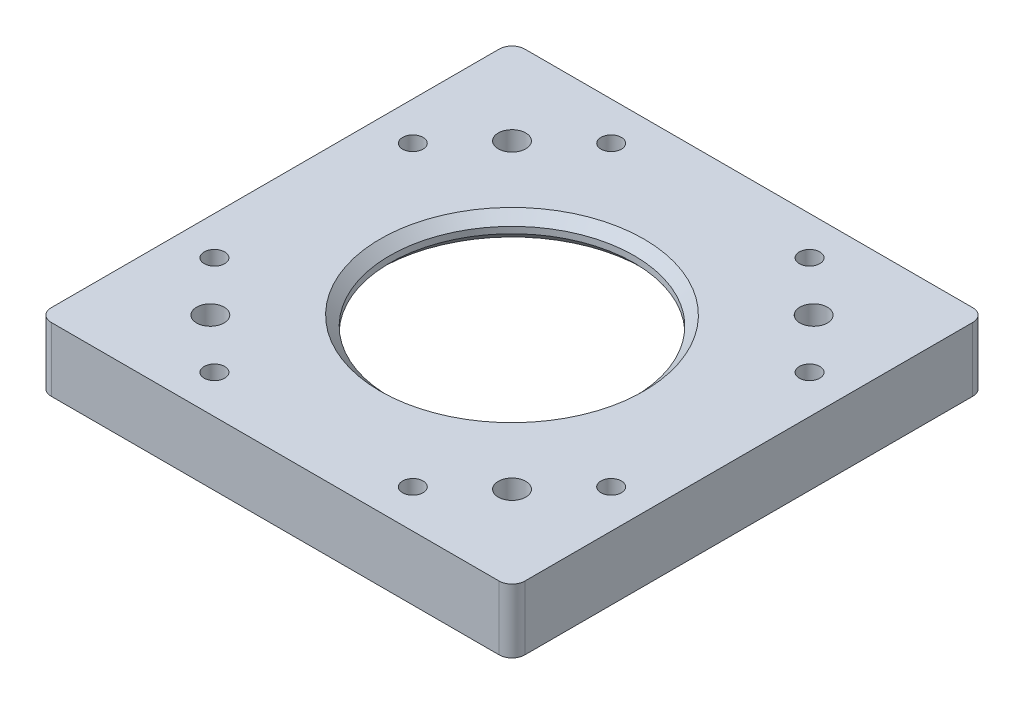
ISO-10303-21;
HEADER;
FILE_DESCRIPTION(('STEP AP214'),'2;1');
FILE_NAME('part.step','',(''),(''),'','','');
FILE_SCHEMA(('AUTOMOTIVE_DESIGN { 1 0 10303 214 1 1 1 1 }'));
ENDSEC;
DATA;
#1=APPLICATION_CONTEXT('core data for automotive mechanical design processes');
#2=APPLICATION_PROTOCOL_DEFINITION('international standard','automotive_design',2000,#1);
#3=PRODUCT_CONTEXT('',#1,'mechanical');
#4=PRODUCT('Part','Part','',(#3));
#5=PRODUCT_RELATED_PRODUCT_CATEGORY('part','',(#4));
#6=PRODUCT_DEFINITION_FORMATION('','',#4);
#7=PRODUCT_DEFINITION_CONTEXT('part definition',#1,'design');
#8=PRODUCT_DEFINITION('design','',#6,#7);
#9=PRODUCT_DEFINITION_SHAPE('','',#8);
#10=(LENGTH_UNIT() NAMED_UNIT(*) SI_UNIT(.MILLI.,.METRE.));
#11=(NAMED_UNIT(*) PLANE_ANGLE_UNIT() SI_UNIT($,.RADIAN.));
#12=(NAMED_UNIT(*) SI_UNIT($,.STERADIAN.) SOLID_ANGLE_UNIT());
#13=UNCERTAINTY_MEASURE_WITH_UNIT(LENGTH_MEASURE(1.E-05),#10,'distance_accuracy_value','');
#14=(GEOMETRIC_REPRESENTATION_CONTEXT(3) GLOBAL_UNCERTAINTY_ASSIGNED_CONTEXT((#13)) GLOBAL_UNIT_ASSIGNED_CONTEXT((#10,
#11,#12)) REPRESENTATION_CONTEXT('',''));
#15=CARTESIAN_POINT('',(0.,0.,0.));
#16=DIRECTION('',(0.,0.,1.));
#17=DIRECTION('',(1.,0.,0.));
#18=AXIS2_PLACEMENT_3D('',#15,#16,#17);
#19=CARTESIAN_POINT('',(0.,10.,0.));
#20=DIRECTION('',(0.,-1.,0.));
#21=DIRECTION('',(0.,0.,-1.));
#22=AXIS2_PLACEMENT_3D('',#19,#20,#21);
#23=PLANE('',#22);
#24=CARTESIAN_POINT('',(0.,10.,0.));
#25=DIRECTION('',(0.,-1.,0.));
#26=DIRECTION('',(0.,0.,-1.));
#27=AXIS2_PLACEMENT_3D('',#24,#25,#26);
#28=CIRCLE('',#27,20.5999999999999);
#29=CARTESIAN_POINT('',(0.,10.,-20.5999999999999));
#30=VERTEX_POINT('',#29);
#31=EDGE_CURVE('E376',#30,#30,#28,.T.);
#32=ORIENTED_EDGE('',*,*,#31,.T.);
#33=EDGE_LOOP('',(#32));
#34=FACE_BOUND('',#33,.T.);
#35=DIRECTION('',(-1.,0.,0.));
#36=VECTOR('',#35,1.);
#37=CARTESIAN_POINT('',(-37.,10.,-37.));
#38=LINE('',#37,#36);
#39=CARTESIAN_POINT('',(35.,10.,-37.));
#40=VERTEX_POINT('',#39);
#41=CARTESIAN_POINT('',(-35.,10.,-37.));
#42=VERTEX_POINT('',#41);
#43=EDGE_CURVE('E301',#40,#42,#38,.T.);
#44=ORIENTED_EDGE('',*,*,#43,.T.);
#45=CARTESIAN_POINT('',(-35.,10.,-35.));
#46=DIRECTION('',(0.,-1.,0.));
#47=DIRECTION('',(0.,0.,-1.));
#48=AXIS2_PLACEMENT_3D('',#45,#46,#47);
#49=CIRCLE('',#48,2.);
#50=CARTESIAN_POINT('',(-37.,10.,-35.));
#51=VERTEX_POINT('',#50);
#52=EDGE_CURVE('E418',#42,#51,#49,.F.);
#53=ORIENTED_EDGE('',*,*,#52,.T.);
#54=DIRECTION('',(0.,0.,1.));
#55=VECTOR('',#54,1.);
#56=CARTESIAN_POINT('',(-37.,10.,37.));
#57=LINE('',#56,#55);
#58=CARTESIAN_POINT('',(-37.,10.,35.));
#59=VERTEX_POINT('',#58);
#60=EDGE_CURVE('E306',#51,#59,#57,.T.);
#61=ORIENTED_EDGE('',*,*,#60,.T.);
#62=CARTESIAN_POINT('',(-35.,10.,35.));
#63=DIRECTION('',(0.,-1.,0.));
#64=DIRECTION('',(0.,0.,-1.));
#65=AXIS2_PLACEMENT_3D('',#62,#63,#64);
#66=CIRCLE('',#65,2.);
#67=CARTESIAN_POINT('',(-35.,10.,37.));
#68=VERTEX_POINT('',#67);
#69=EDGE_CURVE('E64',#59,#68,#66,.F.);
#70=ORIENTED_EDGE('',*,*,#69,.T.);
#71=DIRECTION('',(1.,0.,0.));
#72=VECTOR('',#71,1.);
#73=CARTESIAN_POINT('',(-37.,10.,37.));
#74=LINE('',#73,#72);
#75=CARTESIAN_POINT('',(35.,10.,37.));
#76=VERTEX_POINT('',#75);
#77=EDGE_CURVE('E309',#68,#76,#74,.T.);
#78=ORIENTED_EDGE('',*,*,#77,.T.);
#79=CARTESIAN_POINT('',(35.,10.,35.));
#80=DIRECTION('',(0.,-1.,0.));
#81=DIRECTION('',(0.,0.,-1.));
#82=AXIS2_PLACEMENT_3D('',#79,#80,#81);
#83=CIRCLE('',#82,2.);
#84=CARTESIAN_POINT('',(37.,10.,35.));
#85=VERTEX_POINT('',#84);
#86=EDGE_CURVE('E412',#76,#85,#83,.F.);
#87=ORIENTED_EDGE('',*,*,#86,.T.);
#88=DIRECTION('',(0.,0.,-1.));
#89=VECTOR('',#88,1.);
#90=CARTESIAN_POINT('',(37.,10.,37.));
#91=LINE('',#90,#89);
#92=CARTESIAN_POINT('',(37.,10.,-35.));
#93=VERTEX_POINT('',#92);
#94=EDGE_CURVE('E297',#85,#93,#91,.T.);
#95=ORIENTED_EDGE('',*,*,#94,.T.);
#96=CARTESIAN_POINT('',(35.,10.,-35.));
#97=DIRECTION('',(0.,-1.,0.));
#98=DIRECTION('',(0.,0.,-1.));
#99=AXIS2_PLACEMENT_3D('',#96,#97,#98);
#100=CIRCLE('',#99,2.);
#101=EDGE_CURVE('E415',#93,#40,#100,.F.);
#102=ORIENTED_EDGE('',*,*,#101,.T.);
#103=EDGE_LOOP('',(#44,#53,#61,#70,#78,#87,#95,#102));
#104=FACE_BOUND('',#103,.T.);
#105=CARTESIAN_POINT('',(23.57,10.,-23.57));
#106=DIRECTION('',(0.,1.,0.));
#107=DIRECTION('',(0.,0.,1.));
#108=AXIS2_PLACEMENT_3D('',#105,#106,#107);
#109=CIRCLE('',#108,2.15000000000001);
#110=CARTESIAN_POINT('',(23.57,10.,-21.42));
#111=VERTEX_POINT('',#110);
#112=EDGE_CURVE('E292',#111,#111,#109,.T.);
#113=ORIENTED_EDGE('',*,*,#112,.F.);
#114=EDGE_LOOP('',(#113));
#115=FACE_BOUND('',#114,.T.);
#116=CARTESIAN_POINT('',(-23.57,10.,-23.5699999999997));
#117=DIRECTION('',(0.,1.,0.));
#118=DIRECTION('',(0.,0.,1.));
#119=AXIS2_PLACEMENT_3D('',#116,#117,#118);
#120=CIRCLE('',#119,2.15000000000001);
#121=CARTESIAN_POINT('',(-23.57,10.,-21.4199999999997));
#122=VERTEX_POINT('',#121);
#123=EDGE_CURVE('E288',#122,#122,#120,.T.);
#124=ORIENTED_EDGE('',*,*,#123,.F.);
#125=EDGE_LOOP('',(#124));
#126=FACE_BOUND('',#125,.T.);
#127=CARTESIAN_POINT('',(-23.5699999999995,10.,23.5700000000003));
#128=DIRECTION('',(0.,1.,0.));
#129=DIRECTION('',(0.,0.,1.));
#130=AXIS2_PLACEMENT_3D('',#127,#128,#129);
#131=CIRCLE('',#130,2.15000000000001);
#132=CARTESIAN_POINT('',(-23.5699999999995,10.,25.7200000000003));
#133=VERTEX_POINT('',#132);
#134=EDGE_CURVE('E284',#133,#133,#131,.T.);
#135=ORIENTED_EDGE('',*,*,#134,.F.);
#136=EDGE_LOOP('',(#135));
#137=FACE_BOUND('',#136,.T.);
#138=CARTESIAN_POINT('',(23.5700000000005,10.,23.57));
#139=DIRECTION('',(0.,1.,0.));
#140=DIRECTION('',(0.,0.,1.));
#141=AXIS2_PLACEMENT_3D('',#138,#139,#140);
#142=CIRCLE('',#141,2.14999999999999);
#143=CARTESIAN_POINT('',(23.5700000000005,10.,25.72));
#144=VERTEX_POINT('',#143);
#145=EDGE_CURVE('E277',#144,#144,#142,.T.);
#146=ORIENTED_EDGE('',*,*,#145,.F.);
#147=EDGE_LOOP('',(#146));
#148=FACE_BOUND('',#147,.T.);
#149=CARTESIAN_POINT('',(15.5,10.,-31.));
#150=DIRECTION('',(0.,1.,0.));
#151=DIRECTION('',(0.,0.,1.));
#152=AXIS2_PLACEMENT_3D('',#149,#150,#151);
#153=CIRCLE('',#152,1.6);
#154=CARTESIAN_POINT('',(15.5,10.,-29.4));
#155=VERTEX_POINT('',#154);
#156=EDGE_CURVE('E273',#155,#155,#153,.T.);
#157=ORIENTED_EDGE('',*,*,#156,.F.);
#158=EDGE_LOOP('',(#157));
#159=FACE_BOUND('',#158,.T.);
#160=CARTESIAN_POINT('',(-15.5,10.,-31.));
#161=DIRECTION('',(0.,1.,0.));
#162=DIRECTION('',(0.,0.,-1.));
#163=AXIS2_PLACEMENT_3D('',#160,#161,#162);
#164=CIRCLE('',#163,1.6);
#165=CARTESIAN_POINT('',(-15.5,10.,-32.6));
#166=VERTEX_POINT('',#165);
#167=EDGE_CURVE('E265',#166,#166,#164,.T.);
#168=ORIENTED_EDGE('',*,*,#167,.F.);
#169=EDGE_LOOP('',(#168));
#170=FACE_BOUND('',#169,.T.);
#171=CARTESIAN_POINT('',(31.0000000000009,10.,15.4999999999991));
#172=DIRECTION('',(0.,1.,0.));
#173=DIRECTION('',(0.,0.,1.));
#174=AXIS2_PLACEMENT_3D('',#171,#172,#173);
#175=CIRCLE('',#174,1.60000000000067);
#176=CARTESIAN_POINT('',(31.0000000000009,10.,17.0999999999998));
#177=VERTEX_POINT('',#176);
#178=EDGE_CURVE('E257',#177,#177,#175,.T.);
#179=ORIENTED_EDGE('',*,*,#178,.F.);
#180=EDGE_LOOP('',(#179));
#181=FACE_BOUND('',#180,.T.);
#182=CARTESIAN_POINT('',(31.0000000000009,10.,-15.5000000000009));
#183=DIRECTION('',(0.,1.,0.));
#184=DIRECTION('',(0.,0.,-1.));
#185=AXIS2_PLACEMENT_3D('',#182,#183,#184);
#186=CIRCLE('',#185,1.59999999999882);
#187=CARTESIAN_POINT('',(31.0000000000009,10.,-17.0999999999997));
#188=VERTEX_POINT('',#187);
#189=EDGE_CURVE('E249',#188,#188,#186,.T.);
#190=ORIENTED_EDGE('',*,*,#189,.F.);
#191=EDGE_LOOP('',(#190));
#192=FACE_BOUND('',#191,.T.);
#193=CARTESIAN_POINT('',(-15.4999999999983,10.,31.));
#194=DIRECTION('',(0.,1.,0.));
#195=DIRECTION('',(0.,0.,1.));
#196=AXIS2_PLACEMENT_3D('',#193,#194,#195);
#197=CIRCLE('',#196,1.60000000000185);
#198=CARTESIAN_POINT('',(-15.4999999999983,10.,32.6000000000019));
#199=VERTEX_POINT('',#198);
#200=EDGE_CURVE('E241',#199,#199,#197,.T.);
#201=ORIENTED_EDGE('',*,*,#200,.F.);
#202=EDGE_LOOP('',(#201));
#203=FACE_BOUND('',#202,.T.);
#204=CARTESIAN_POINT('',(15.5000000000017,10.,31.));
#205=DIRECTION('',(0.,1.,0.));
#206=DIRECTION('',(0.,0.,-1.));
#207=AXIS2_PLACEMENT_3D('',#204,#205,#206);
#208=CIRCLE('',#207,1.59999999999816);
#209=CARTESIAN_POINT('',(15.5000000000017,10.,29.4000000000018));
#210=VERTEX_POINT('',#209);
#211=EDGE_CURVE('E233',#210,#210,#208,.T.);
#212=ORIENTED_EDGE('',*,*,#211,.F.);
#213=EDGE_LOOP('',(#212));
#214=FACE_BOUND('',#213,.T.);
#215=CARTESIAN_POINT('',(-30.9999999999991,10.,-15.4999999999991));
#216=DIRECTION('',(0.,1.,0.));
#217=DIRECTION('',(0.,0.,1.));
#218=AXIS2_PLACEMENT_3D('',#215,#216,#217);
#219=CIRCLE('',#218,1.60000000000136);
#220=CARTESIAN_POINT('',(-30.9999999999991,10.,-13.8999999999978));
#221=VERTEX_POINT('',#220);
#222=EDGE_CURVE('E225',#221,#221,#219,.T.);
#223=ORIENTED_EDGE('',*,*,#222,.F.);
#224=EDGE_LOOP('',(#223));
#225=FACE_BOUND('',#224,.T.);
#226=CARTESIAN_POINT('',(-30.9999999999991,10.,15.5000000000009));
#227=DIRECTION('',(0.,1.,0.));
#228=DIRECTION('',(0.,0.,-1.));
#229=AXIS2_PLACEMENT_3D('',#226,#227,#228);
#230=CIRCLE('',#229,1.59999999999916);
#231=CARTESIAN_POINT('',(-30.9999999999991,10.,13.9000000000017));
#232=VERTEX_POINT('',#231);
#233=EDGE_CURVE('E217',#232,#232,#230,.T.);
#234=ORIENTED_EDGE('',*,*,#233,.F.);
#235=EDGE_LOOP('',(#234));
#236=FACE_BOUND('',#235,.T.);
#237=ADVANCED_FACE('F43',(#34,#104,#115,#126,#137,#148,#159,#170,#181,#192,#203,#214,#225,#236),
#23,.F.);
#238=CARTESIAN_POINT('',(0.,0.,0.));
#239=DIRECTION('',(0.,-1.,0.));
#240=DIRECTION('',(0.,0.,-1.));
#241=AXIS2_PLACEMENT_3D('',#238,#239,#240);
#242=PLANE('',#241);
#243=DIRECTION('',(0.,0.,1.));
#244=VECTOR('',#243,1.);
#245=CARTESIAN_POINT('',(28.6,0.,-28.6));
#246=LINE('',#245,#244);
#247=CARTESIAN_POINT('',(28.6,0.,-25.6));
#248=VERTEX_POINT('',#247);
#249=CARTESIAN_POINT('',(28.6,0.,25.6));
#250=VERTEX_POINT('',#249);
#251=EDGE_CURVE('E189',#248,#250,#246,.T.);
#252=ORIENTED_EDGE('',*,*,#251,.F.);
#253=CARTESIAN_POINT('',(25.6,0.,-25.6));
#254=DIRECTION('',(0.,-1.,0.));
#255=DIRECTION('',(0.,0.,-1.));
#256=AXIS2_PLACEMENT_3D('',#253,#254,#255);
#257=CIRCLE('',#256,3.);
#258=CARTESIAN_POINT('',(25.6,0.,-28.6));
#259=VERTEX_POINT('',#258);
#260=EDGE_CURVE('E168',#248,#259,#257,.F.);
#261=ORIENTED_EDGE('',*,*,#260,.T.);
#262=DIRECTION('',(1.,0.,0.));
#263=VECTOR('',#262,1.);
#264=CARTESIAN_POINT('',(-28.6,0.,-28.6));
#265=LINE('',#264,#263);
#266=CARTESIAN_POINT('',(-25.6,0.,-28.6));
#267=VERTEX_POINT('',#266);
#268=EDGE_CURVE('E194',#267,#259,#265,.T.);
#269=ORIENTED_EDGE('',*,*,#268,.F.);
#270=CARTESIAN_POINT('',(-25.6,0.,-25.6));
#271=DIRECTION('',(0.,-1.,0.));
#272=DIRECTION('',(0.,0.,-1.));
#273=AXIS2_PLACEMENT_3D('',#270,#271,#272);
#274=CIRCLE('',#273,3.);
#275=CARTESIAN_POINT('',(-28.6,0.,-25.6));
#276=VERTEX_POINT('',#275);
#277=EDGE_CURVE('E363',#267,#276,#274,.F.);
#278=ORIENTED_EDGE('',*,*,#277,.T.);
#279=DIRECTION('',(0.,0.,-1.));
#280=VECTOR('',#279,1.);
#281=CARTESIAN_POINT('',(-28.6,0.,-28.6));
#282=LINE('',#281,#280);
#283=CARTESIAN_POINT('',(-28.6,0.,25.6));
#284=VERTEX_POINT('',#283);
#285=EDGE_CURVE('E188',#284,#276,#282,.T.);
#286=ORIENTED_EDGE('',*,*,#285,.F.);
#287=CARTESIAN_POINT('',(-25.6,0.,25.6));
#288=DIRECTION('',(0.,-1.,0.));
#289=DIRECTION('',(0.,0.,-1.));
#290=AXIS2_PLACEMENT_3D('',#287,#288,#289);
#291=CIRCLE('',#290,3.);
#292=CARTESIAN_POINT('',(-25.6,0.,28.6));
#293=VERTEX_POINT('',#292);
#294=EDGE_CURVE('E186',#284,#293,#291,.F.);
#295=ORIENTED_EDGE('',*,*,#294,.T.);
#296=DIRECTION('',(-1.,0.,0.));
#297=VECTOR('',#296,1.);
#298=CARTESIAN_POINT('',(-28.6,0.,28.6));
#299=LINE('',#298,#297);
#300=CARTESIAN_POINT('',(25.6,0.,28.6));
#301=VERTEX_POINT('',#300);
#302=EDGE_CURVE('E175',#301,#293,#299,.T.);
#303=ORIENTED_EDGE('',*,*,#302,.F.);
#304=CARTESIAN_POINT('',(25.6,0.,25.6));
#305=DIRECTION('',(0.,-1.,0.));
#306=DIRECTION('',(0.,0.,-1.));
#307=AXIS2_PLACEMENT_3D('',#304,#305,#306);
#308=CIRCLE('',#307,3.);
#309=EDGE_CURVE('E157',#301,#250,#308,.F.);
#310=ORIENTED_EDGE('',*,*,#309,.T.);
#311=EDGE_LOOP('',(#252,#261,#269,#278,#286,#295,#303,#310));
#312=FACE_BOUND('',#311,.T.);
#313=CARTESIAN_POINT('',(-30.9999999999991,0.,-15.4999999999991));
#314=DIRECTION('',(0.,1.,0.));
#315=DIRECTION('',(0.,0.,1.));
#316=AXIS2_PLACEMENT_3D('',#313,#314,#315);
#317=CIRCLE('',#316,1.60000000000136);
#318=CARTESIAN_POINT('',(-30.9999999999991,0.,-13.8999999999978));
#319=VERTEX_POINT('',#318);
#320=EDGE_CURVE('E221',#319,#319,#317,.T.);
#321=ORIENTED_EDGE('',*,*,#320,.T.);
#322=EDGE_LOOP('',(#321));
#323=FACE_BOUND('',#322,.T.);
#324=CARTESIAN_POINT('',(-15.4999999999983,0.,31.));
#325=DIRECTION('',(0.,1.,0.));
#326=DIRECTION('',(0.,0.,1.));
#327=AXIS2_PLACEMENT_3D('',#324,#325,#326);
#328=CIRCLE('',#327,1.60000000000185);
#329=CARTESIAN_POINT('',(-15.4999999999983,0.,32.6000000000019));
#330=VERTEX_POINT('',#329);
#331=EDGE_CURVE('E237',#330,#330,#328,.T.);
#332=ORIENTED_EDGE('',*,*,#331,.T.);
#333=EDGE_LOOP('',(#332));
#334=FACE_BOUND('',#333,.T.);
#335=CARTESIAN_POINT('',(31.0000000000009,0.,15.4999999999991));
#336=DIRECTION('',(0.,1.,0.));
#337=DIRECTION('',(0.,0.,1.));
#338=AXIS2_PLACEMENT_3D('',#335,#336,#337);
#339=CIRCLE('',#338,1.60000000000067);
#340=CARTESIAN_POINT('',(31.0000000000009,0.,17.0999999999998));
#341=VERTEX_POINT('',#340);
#342=EDGE_CURVE('E253',#341,#341,#339,.T.);
#343=ORIENTED_EDGE('',*,*,#342,.T.);
#344=EDGE_LOOP('',(#343));
#345=FACE_BOUND('',#344,.T.);
#346=CARTESIAN_POINT('',(15.5,0.,-31.));
#347=DIRECTION('',(0.,1.,0.));
#348=DIRECTION('',(0.,0.,1.));
#349=AXIS2_PLACEMENT_3D('',#346,#347,#348);
#350=CIRCLE('',#349,1.6);
#351=CARTESIAN_POINT('',(15.5,0.,-29.4));
#352=VERTEX_POINT('',#351);
#353=EDGE_CURVE('E269',#352,#352,#350,.T.);
#354=ORIENTED_EDGE('',*,*,#353,.T.);
#355=EDGE_LOOP('',(#354));
#356=FACE_BOUND('',#355,.T.);
#357=DIRECTION('',(0.,0.,1.));
#358=VECTOR('',#357,1.);
#359=CARTESIAN_POINT('',(-37.,0.,37.));
#360=LINE('',#359,#358);
#361=CARTESIAN_POINT('',(-37.,0.,-35.));
#362=VERTEX_POINT('',#361);
#363=CARTESIAN_POINT('',(-37.,0.,35.));
#364=VERTEX_POINT('',#363);
#365=EDGE_CURVE('E319',#362,#364,#360,.T.);
#366=ORIENTED_EDGE('',*,*,#365,.F.);
#367=CARTESIAN_POINT('',(-35.,0.,-35.));
#368=DIRECTION('',(0.,-1.,0.));
#369=DIRECTION('',(0.,0.,-1.));
#370=AXIS2_PLACEMENT_3D('',#367,#368,#369);
#371=CIRCLE('',#370,2.);
#372=CARTESIAN_POINT('',(-35.,0.,-37.));
#373=VERTEX_POINT('',#372);
#374=EDGE_CURVE('E400',#362,#373,#371,.T.);
#375=ORIENTED_EDGE('',*,*,#374,.T.);
#376=DIRECTION('',(-1.,0.,0.));
#377=VECTOR('',#376,1.);
#378=CARTESIAN_POINT('',(-37.,0.,-37.));
#379=LINE('',#378,#377);
#380=CARTESIAN_POINT('',(35.,0.,-37.));
#381=VERTEX_POINT('',#380);
#382=EDGE_CURVE('E315',#381,#373,#379,.T.);
#383=ORIENTED_EDGE('',*,*,#382,.F.);
#384=CARTESIAN_POINT('',(35.,0.,-35.));
#385=DIRECTION('',(0.,-1.,0.));
#386=DIRECTION('',(0.,0.,-1.));
#387=AXIS2_PLACEMENT_3D('',#384,#385,#386);
#388=CIRCLE('',#387,2.);
#389=CARTESIAN_POINT('',(37.,0.,-35.));
#390=VERTEX_POINT('',#389);
#391=EDGE_CURVE('E397',#381,#390,#388,.T.);
#392=ORIENTED_EDGE('',*,*,#391,.T.);
#393=DIRECTION('',(0.,0.,-1.));
#394=VECTOR('',#393,1.);
#395=CARTESIAN_POINT('',(37.,0.,37.));
#396=LINE('',#395,#394);
#397=CARTESIAN_POINT('',(37.,0.,35.));
#398=VERTEX_POINT('',#397);
#399=EDGE_CURVE('E296',#398,#390,#396,.T.);
#400=ORIENTED_EDGE('',*,*,#399,.F.);
#401=CARTESIAN_POINT('',(35.,0.,35.));
#402=DIRECTION('',(0.,-1.,0.));
#403=DIRECTION('',(0.,0.,-1.));
#404=AXIS2_PLACEMENT_3D('',#401,#402,#403);
#405=CIRCLE('',#404,2.);
#406=CARTESIAN_POINT('',(35.,0.,37.));
#407=VERTEX_POINT('',#406);
#408=EDGE_CURVE('E394',#398,#407,#405,.T.);
#409=ORIENTED_EDGE('',*,*,#408,.T.);
#410=DIRECTION('',(1.,0.,0.));
#411=VECTOR('',#410,1.);
#412=CARTESIAN_POINT('',(-37.,0.,37.));
#413=LINE('',#412,#411);
#414=CARTESIAN_POINT('',(-35.,0.,37.));
#415=VERTEX_POINT('',#414);
#416=EDGE_CURVE('E302',#415,#407,#413,.T.);
#417=ORIENTED_EDGE('',*,*,#416,.F.);
#418=CARTESIAN_POINT('',(-35.,0.,35.));
#419=DIRECTION('',(0.,-1.,0.));
#420=DIRECTION('',(0.,0.,-1.));
#421=AXIS2_PLACEMENT_3D('',#418,#419,#420);
#422=CIRCLE('',#421,2.);
#423=EDGE_CURVE('E391',#415,#364,#422,.T.);
#424=ORIENTED_EDGE('',*,*,#423,.T.);
#425=EDGE_LOOP('',(#366,#375,#383,#392,#400,#409,#417,#424));
#426=FACE_BOUND('',#425,.T.);
#427=CARTESIAN_POINT('',(-15.5,0.,-31.));
#428=DIRECTION('',(0.,1.,0.));
#429=DIRECTION('',(0.,0.,-1.));
#430=AXIS2_PLACEMENT_3D('',#427,#428,#429);
#431=CIRCLE('',#430,1.6);
#432=CARTESIAN_POINT('',(-15.5,0.,-32.6));
#433=VERTEX_POINT('',#432);
#434=EDGE_CURVE('E261',#433,#433,#431,.T.);
#435=ORIENTED_EDGE('',*,*,#434,.T.);
#436=EDGE_LOOP('',(#435));
#437=FACE_BOUND('',#436,.T.);
#438=CARTESIAN_POINT('',(31.0000000000009,0.,-15.5000000000009));
#439=DIRECTION('',(0.,1.,0.));
#440=DIRECTION('',(0.,0.,-1.));
#441=AXIS2_PLACEMENT_3D('',#438,#439,#440);
#442=CIRCLE('',#441,1.59999999999882);
#443=CARTESIAN_POINT('',(31.0000000000009,0.,-17.0999999999997));
#444=VERTEX_POINT('',#443);
#445=EDGE_CURVE('E245',#444,#444,#442,.T.);
#446=ORIENTED_EDGE('',*,*,#445,.T.);
#447=EDGE_LOOP('',(#446));
#448=FACE_BOUND('',#447,.T.);
#449=CARTESIAN_POINT('',(15.5000000000017,0.,31.));
#450=DIRECTION('',(0.,1.,0.));
#451=DIRECTION('',(0.,0.,-1.));
#452=AXIS2_PLACEMENT_3D('',#449,#450,#451);
#453=CIRCLE('',#452,1.59999999999816);
#454=CARTESIAN_POINT('',(15.5000000000017,0.,29.4000000000018));
#455=VERTEX_POINT('',#454);
#456=EDGE_CURVE('E229',#455,#455,#453,.T.);
#457=ORIENTED_EDGE('',*,*,#456,.T.);
#458=EDGE_LOOP('',(#457));
#459=FACE_BOUND('',#458,.T.);
#460=CARTESIAN_POINT('',(-30.9999999999991,0.,15.5000000000009));
#461=DIRECTION('',(0.,1.,0.));
#462=DIRECTION('',(0.,0.,-1.));
#463=AXIS2_PLACEMENT_3D('',#460,#461,#462);
#464=CIRCLE('',#463,1.59999999999916);
#465=CARTESIAN_POINT('',(-30.9999999999991,0.,13.9000000000017));
#466=VERTEX_POINT('',#465);
#467=EDGE_CURVE('E216',#466,#466,#464,.T.);
#468=ORIENTED_EDGE('',*,*,#467,.T.);
#469=EDGE_LOOP('',(#468));
#470=FACE_BOUND('',#469,.T.);
#471=ADVANCED_FACE('F183',(#312,#323,#334,#345,#356,#426,#437,#448,#459,#470),#242,.T.);
#472=CARTESIAN_POINT('',(37.,10.,37.));
#473=DIRECTION('',(-1.,0.,0.));
#474=DIRECTION('',(0.,0.,1.));
#475=AXIS2_PLACEMENT_3D('',#472,#473,#474);
#476=PLANE('',#475);
#477=ORIENTED_EDGE('',*,*,#399,.T.);
#478=DIRECTION('',(0.,-1.,0.));
#479=VECTOR('',#478,1.);
#480=CARTESIAN_POINT('',(37.,10.,-35.));
#481=LINE('',#480,#479);
#482=EDGE_CURVE('E425',#390,#93,#481,.F.);
#483=ORIENTED_EDGE('',*,*,#482,.T.);
#484=ORIENTED_EDGE('',*,*,#94,.F.);
#485=DIRECTION('',(0.,-1.,0.));
#486=VECTOR('',#485,1.);
#487=CARTESIAN_POINT('',(37.,10.,35.));
#488=LINE('',#487,#486);
#489=EDGE_CURVE('E421',#85,#398,#488,.T.);
#490=ORIENTED_EDGE('',*,*,#489,.T.);
#491=EDGE_LOOP('',(#477,#483,#484,#490));
#492=FACE_BOUND('',#491,.T.);
#493=ADVANCED_FACE('F443',(#492),#476,.F.);
#494=CARTESIAN_POINT('',(-37.,10.,-37.));
#495=DIRECTION('',(0.,0.,1.));
#496=DIRECTION('',(1.,0.,0.));
#497=AXIS2_PLACEMENT_3D('',#494,#495,#496);
#498=PLANE('',#497);
#499=ORIENTED_EDGE('',*,*,#382,.T.);
#500=DIRECTION('',(0.,-1.,0.));
#501=VECTOR('',#500,1.);
#502=CARTESIAN_POINT('',(-35.,10.,-37.));
#503=LINE('',#502,#501);
#504=EDGE_CURVE('E407',#373,#42,#503,.F.);
#505=ORIENTED_EDGE('',*,*,#504,.T.);
#506=ORIENTED_EDGE('',*,*,#43,.F.);
#507=DIRECTION('',(0.,-1.,0.));
#508=VECTOR('',#507,1.);
#509=CARTESIAN_POINT('',(35.,10.,-37.));
#510=LINE('',#509,#508);
#511=EDGE_CURVE('E403',#40,#381,#510,.T.);
#512=ORIENTED_EDGE('',*,*,#511,.T.);
#513=EDGE_LOOP('',(#499,#505,#506,#512));
#514=FACE_BOUND('',#513,.T.);
#515=ADVANCED_FACE('F453',(#514),#498,.F.);
#516=CARTESIAN_POINT('',(-37.,10.,37.));
#517=DIRECTION('',(1.,0.,0.));
#518=DIRECTION('',(0.,0.,-1.));
#519=AXIS2_PLACEMENT_3D('',#516,#517,#518);
#520=PLANE('',#519);
#521=ORIENTED_EDGE('',*,*,#60,.F.);
#522=DIRECTION('',(0.,-1.,0.));
#523=VECTOR('',#522,1.);
#524=CARTESIAN_POINT('',(-37.,10.,-35.));
#525=LINE('',#524,#523);
#526=EDGE_CURVE('E387',#51,#362,#525,.T.);
#527=ORIENTED_EDGE('',*,*,#526,.T.);
#528=ORIENTED_EDGE('',*,*,#365,.T.);
#529=DIRECTION('',(0.,-1.,0.));
#530=VECTOR('',#529,1.);
#531=CARTESIAN_POINT('',(-37.,10.,35.));
#532=LINE('',#531,#530);
#533=EDGE_CURVE('E384',#364,#59,#532,.F.);
#534=ORIENTED_EDGE('',*,*,#533,.T.);
#535=EDGE_LOOP('',(#521,#527,#528,#534));
#536=FACE_BOUND('',#535,.T.);
#537=ADVANCED_FACE('F461',(#536),#520,.F.);
#538=CARTESIAN_POINT('',(-37.,10.,37.));
#539=DIRECTION('',(0.,0.,-1.));
#540=DIRECTION('',(-1.,0.,0.));
#541=AXIS2_PLACEMENT_3D('',#538,#539,#540);
#542=PLANE('',#541);
#543=ORIENTED_EDGE('',*,*,#416,.T.);
#544=DIRECTION('',(0.,-1.,0.));
#545=VECTOR('',#544,1.);
#546=CARTESIAN_POINT('',(35.,10.,37.));
#547=LINE('',#546,#545);
#548=EDGE_CURVE('E11',#407,#76,#547,.F.);
#549=ORIENTED_EDGE('',*,*,#548,.T.);
#550=ORIENTED_EDGE('',*,*,#77,.F.);
#551=DIRECTION('',(0.,-1.,0.));
#552=VECTOR('',#551,1.);
#553=CARTESIAN_POINT('',(-35.,10.,37.));
#554=LINE('',#553,#552);
#555=EDGE_CURVE('E52',#68,#415,#554,.T.);
#556=ORIENTED_EDGE('',*,*,#555,.T.);
#557=EDGE_LOOP('',(#543,#549,#550,#556));
#558=FACE_BOUND('',#557,.T.);
#559=ADVANCED_FACE('F431',(#558),#542,.F.);
#560=CARTESIAN_POINT('',(23.57,10.,-23.57));
#561=DIRECTION('',(0.,-1.,0.));
#562=DIRECTION('',(0.,0.,-1.));
#563=AXIS2_PLACEMENT_3D('',#560,#561,#562);
#564=CYLINDRICAL_SURFACE('',#563,2.15000000000001);
#565=CARTESIAN_POINT('',(23.57,6.,-23.57));
#566=DIRECTION('',(0.,1.,0.));
#567=DIRECTION('',(0.,0.,1.));
#568=AXIS2_PLACEMENT_3D('',#565,#566,#567);
#569=CIRCLE('',#568,2.15000000000001);
#570=CARTESIAN_POINT('',(23.57,6.,-21.42));
#571=VERTEX_POINT('',#570);
#572=EDGE_CURVE('E212',#571,#571,#569,.T.);
#573=ORIENTED_EDGE('',*,*,#572,.F.);
#574=EDGE_LOOP('',(#573));
#575=FACE_BOUND('',#574,.T.);
#576=ORIENTED_EDGE('',*,*,#112,.T.);
#577=EDGE_LOOP('',(#576));
#578=FACE_BOUND('',#577,.T.);
#579=ADVANCED_FACE('F475',(#575,#578),#564,.F.);
#580=CARTESIAN_POINT('',(0.,10.,0.));
#581=DIRECTION('',(0.,-1.,0.));
#582=DIRECTION('',(0.,0.,-1.));
#583=AXIS2_PLACEMENT_3D('',#580,#581,#582);
#584=CYLINDRICAL_SURFACE('',#583,19.1);
#585=CARTESIAN_POINT('',(0.,8.50000000000001,0.));
#586=DIRECTION('',(0.,-1.,0.));
#587=DIRECTION('',(0.,0.,-1.));
#588=AXIS2_PLACEMENT_3D('',#585,#586,#587);
#589=CIRCLE('',#588,19.1);
#590=CARTESIAN_POINT('',(0.,8.50000000000001,-19.1));
#591=VERTEX_POINT('',#590);
#592=EDGE_CURVE('E372',#591,#591,#589,.F.);
#593=ORIENTED_EDGE('',*,*,#592,.T.);
#594=EDGE_LOOP('',(#593));
#595=FACE_BOUND('',#594,.T.);
#596=CARTESIAN_POINT('',(0.,7.49999999999999,0.));
#597=DIRECTION('',(0.,1.,0.));
#598=DIRECTION('',(0.,0.,1.));
#599=AXIS2_PLACEMENT_3D('',#596,#597,#598);
#600=CIRCLE('',#599,19.1);
#601=CARTESIAN_POINT('',(0.,7.49999999999999,-19.1));
#602=VERTEX_POINT('',#601);
#603=EDGE_CURVE('E368',#602,#602,#600,.F.);
#604=ORIENTED_EDGE('',*,*,#603,.T.);
#605=EDGE_LOOP('',(#604));
#606=FACE_BOUND('',#605,.T.);
#607=ADVANCED_FACE('F712',(#595,#606),#584,.F.);
#608=CARTESIAN_POINT('',(-23.57,10.,-23.5699999999997));
#609=DIRECTION('',(0.,-1.,0.));
#610=DIRECTION('',(0.,0.,-1.));
#611=AXIS2_PLACEMENT_3D('',#608,#609,#610);
#612=CYLINDRICAL_SURFACE('',#611,2.15000000000001);
#613=CARTESIAN_POINT('',(-23.57,6.,-23.5699999999997));
#614=DIRECTION('',(0.,1.,0.));
#615=DIRECTION('',(0.,0.,1.));
#616=AXIS2_PLACEMENT_3D('',#613,#614,#615);
#617=CIRCLE('',#616,2.15000000000001);
#618=CARTESIAN_POINT('',(-23.57,6.,-21.4199999999997));
#619=VERTEX_POINT('',#618);
#620=EDGE_CURVE('E207',#619,#619,#617,.T.);
#621=ORIENTED_EDGE('',*,*,#620,.F.);
#622=EDGE_LOOP('',(#621));
#623=FACE_BOUND('',#622,.T.);
#624=ORIENTED_EDGE('',*,*,#123,.T.);
#625=EDGE_LOOP('',(#624));
#626=FACE_BOUND('',#625,.T.);
#627=ADVANCED_FACE('F703',(#623,#626),#612,.F.);
#628=CARTESIAN_POINT('',(-23.5699999999995,10.,23.5700000000003));
#629=DIRECTION('',(0.,-1.,0.));
#630=DIRECTION('',(0.,0.,-1.));
#631=AXIS2_PLACEMENT_3D('',#628,#629,#630);
#632=CYLINDRICAL_SURFACE('',#631,2.15000000000001);
#633=CARTESIAN_POINT('',(-23.5699999999995,6.,23.5700000000003));
#634=DIRECTION('',(0.,1.,0.));
#635=DIRECTION('',(0.,0.,1.));
#636=AXIS2_PLACEMENT_3D('',#633,#634,#635);
#637=CIRCLE('',#636,2.15000000000001);
#638=CARTESIAN_POINT('',(-23.5699999999995,6.,25.7200000000003));
#639=VERTEX_POINT('',#638);
#640=EDGE_CURVE('E203',#639,#639,#637,.T.);
#641=ORIENTED_EDGE('',*,*,#640,.F.);
#642=EDGE_LOOP('',(#641));
#643=FACE_BOUND('',#642,.T.);
#644=ORIENTED_EDGE('',*,*,#134,.T.);
#645=EDGE_LOOP('',(#644));
#646=FACE_BOUND('',#645,.T.);
#647=ADVANCED_FACE('F694',(#643,#646),#632,.F.);
#648=CARTESIAN_POINT('',(23.5700000000005,10.,23.57));
#649=DIRECTION('',(0.,-1.,0.));
#650=DIRECTION('',(0.,0.,-1.));
#651=AXIS2_PLACEMENT_3D('',#648,#649,#650);
#652=CYLINDRICAL_SURFACE('',#651,2.14999999999999);
#653=CARTESIAN_POINT('',(23.5700000000005,6.,23.57));
#654=DIRECTION('',(0.,1.,0.));
#655=DIRECTION('',(0.,0.,1.));
#656=AXIS2_PLACEMENT_3D('',#653,#654,#655);
#657=CIRCLE('',#656,2.14999999999999);
#658=CARTESIAN_POINT('',(23.5700000000005,6.,25.72));
#659=VERTEX_POINT('',#658);
#660=EDGE_CURVE('E208',#659,#659,#657,.T.);
#661=ORIENTED_EDGE('',*,*,#660,.F.);
#662=EDGE_LOOP('',(#661));
#663=FACE_BOUND('',#662,.T.);
#664=ORIENTED_EDGE('',*,*,#145,.T.);
#665=EDGE_LOOP('',(#664));
#666=FACE_BOUND('',#665,.T.);
#667=ADVANCED_FACE('F686',(#663,#666),#652,.F.);
#668=CARTESIAN_POINT('',(15.5,10.,-31.));
#669=DIRECTION('',(0.,-1.,0.));
#670=DIRECTION('',(0.,0.,-1.));
#671=AXIS2_PLACEMENT_3D('',#668,#669,#670);
#672=CYLINDRICAL_SURFACE('',#671,1.6);
#673=ORIENTED_EDGE('',*,*,#156,.T.);
#674=EDGE_LOOP('',(#673));
#675=FACE_BOUND('',#674,.T.);
#676=ORIENTED_EDGE('',*,*,#353,.F.);
#677=EDGE_LOOP('',(#676));
#678=FACE_BOUND('',#677,.T.);
#679=ADVANCED_FACE('F677',(#675,#678),#672,.F.);
#680=CARTESIAN_POINT('',(-15.5,10.,-31.));
#681=DIRECTION('',(0.,-1.,0.));
#682=DIRECTION('',(0.,0.,-1.));
#683=AXIS2_PLACEMENT_3D('',#680,#681,#682);
#684=CYLINDRICAL_SURFACE('',#683,1.6);
#685=ORIENTED_EDGE('',*,*,#167,.T.);
#686=EDGE_LOOP('',(#685));
#687=FACE_BOUND('',#686,.T.);
#688=ORIENTED_EDGE('',*,*,#434,.F.);
#689=EDGE_LOOP('',(#688));
#690=FACE_BOUND('',#689,.T.);
#691=ADVANCED_FACE('F668',(#687,#690),#684,.F.);
#692=CARTESIAN_POINT('',(31.0000000000009,10.,15.4999999999991));
#693=DIRECTION('',(0.,-1.,0.));
#694=DIRECTION('',(0.,0.,-1.));
#695=AXIS2_PLACEMENT_3D('',#692,#693,#694);
#696=CYLINDRICAL_SURFACE('',#695,1.60000000000067);
#697=ORIENTED_EDGE('',*,*,#178,.T.);
#698=EDGE_LOOP('',(#697));
#699=FACE_BOUND('',#698,.T.);
#700=ORIENTED_EDGE('',*,*,#342,.F.);
#701=EDGE_LOOP('',(#700));
#702=FACE_BOUND('',#701,.T.);
#703=ADVANCED_FACE('F659',(#699,#702),#696,.F.);
#704=CARTESIAN_POINT('',(31.0000000000009,10.,-15.5000000000009));
#705=DIRECTION('',(0.,-1.,0.));
#706=DIRECTION('',(0.,0.,-1.));
#707=AXIS2_PLACEMENT_3D('',#704,#705,#706);
#708=CYLINDRICAL_SURFACE('',#707,1.59999999999882);
#709=ORIENTED_EDGE('',*,*,#189,.T.);
#710=EDGE_LOOP('',(#709));
#711=FACE_BOUND('',#710,.T.);
#712=ORIENTED_EDGE('',*,*,#445,.F.);
#713=EDGE_LOOP('',(#712));
#714=FACE_BOUND('',#713,.T.);
#715=ADVANCED_FACE('F650',(#711,#714),#708,.F.);
#716=CARTESIAN_POINT('',(-15.4999999999983,10.,31.));
#717=DIRECTION('',(0.,-1.,0.));
#718=DIRECTION('',(0.,0.,-1.));
#719=AXIS2_PLACEMENT_3D('',#716,#717,#718);
#720=CYLINDRICAL_SURFACE('',#719,1.60000000000185);
#721=ORIENTED_EDGE('',*,*,#200,.T.);
#722=EDGE_LOOP('',(#721));
#723=FACE_BOUND('',#722,.T.);
#724=ORIENTED_EDGE('',*,*,#331,.F.);
#725=EDGE_LOOP('',(#724));
#726=FACE_BOUND('',#725,.T.);
#727=ADVANCED_FACE('F641',(#723,#726),#720,.F.);
#728=CARTESIAN_POINT('',(15.5000000000017,10.,31.));
#729=DIRECTION('',(0.,-1.,0.));
#730=DIRECTION('',(0.,0.,-1.));
#731=AXIS2_PLACEMENT_3D('',#728,#729,#730);
#732=CYLINDRICAL_SURFACE('',#731,1.59999999999816);
#733=ORIENTED_EDGE('',*,*,#211,.T.);
#734=EDGE_LOOP('',(#733));
#735=FACE_BOUND('',#734,.T.);
#736=ORIENTED_EDGE('',*,*,#456,.F.);
#737=EDGE_LOOP('',(#736));
#738=FACE_BOUND('',#737,.T.);
#739=ADVANCED_FACE('F632',(#735,#738),#732,.F.);
#740=CARTESIAN_POINT('',(-30.9999999999991,10.,-15.4999999999991));
#741=DIRECTION('',(0.,-1.,0.));
#742=DIRECTION('',(0.,0.,-1.));
#743=AXIS2_PLACEMENT_3D('',#740,#741,#742);
#744=CYLINDRICAL_SURFACE('',#743,1.60000000000136);
#745=ORIENTED_EDGE('',*,*,#222,.T.);
#746=EDGE_LOOP('',(#745));
#747=FACE_BOUND('',#746,.T.);
#748=ORIENTED_EDGE('',*,*,#320,.F.);
#749=EDGE_LOOP('',(#748));
#750=FACE_BOUND('',#749,.T.);
#751=ADVANCED_FACE('F622',(#747,#750),#744,.F.);
#752=CARTESIAN_POINT('',(-30.9999999999991,10.,15.5000000000009));
#753=DIRECTION('',(0.,-1.,0.));
#754=DIRECTION('',(0.,0.,-1.));
#755=AXIS2_PLACEMENT_3D('',#752,#753,#754);
#756=CYLINDRICAL_SURFACE('',#755,1.59999999999916);
#757=ORIENTED_EDGE('',*,*,#233,.T.);
#758=EDGE_LOOP('',(#757));
#759=FACE_BOUND('',#758,.T.);
#760=ORIENTED_EDGE('',*,*,#467,.F.);
#761=EDGE_LOOP('',(#760));
#762=FACE_BOUND('',#761,.T.);
#763=ADVANCED_FACE('F612',(#759,#762),#756,.F.);
#764=CARTESIAN_POINT('',(28.6,6.,-28.6));
#765=DIRECTION('',(1.,0.,0.));
#766=DIRECTION('',(0.,0.,-1.));
#767=AXIS2_PLACEMENT_3D('',#764,#765,#766);
#768=PLANE('',#767);
#769=ORIENTED_EDGE('',*,*,#251,.T.);
#770=DIRECTION('',(0.,-1.,0.));
#771=VECTOR('',#770,1.);
#772=CARTESIAN_POINT('',(28.6,6.,25.6));
#773=LINE('',#772,#771);
#774=CARTESIAN_POINT('',(28.6,6.,25.6));
#775=VERTEX_POINT('',#774);
#776=EDGE_CURVE('E162',#250,#775,#773,.F.);
#777=ORIENTED_EDGE('',*,*,#776,.T.);
#778=DIRECTION('',(0.,0.,1.));
#779=VECTOR('',#778,1.);
#780=CARTESIAN_POINT('',(28.6,6.,-28.6));
#781=LINE('',#780,#779);
#782=CARTESIAN_POINT('',(28.6,6.,-25.6));
#783=VERTEX_POINT('',#782);
#784=EDGE_CURVE('E202',#783,#775,#781,.T.);
#785=ORIENTED_EDGE('',*,*,#784,.F.);
#786=DIRECTION('',(0.,-1.,0.));
#787=VECTOR('',#786,1.);
#788=CARTESIAN_POINT('',(28.6,0.,-25.6));
#789=LINE('',#788,#787);
#790=EDGE_CURVE('E180',#783,#248,#789,.T.);
#791=ORIENTED_EDGE('',*,*,#790,.T.);
#792=EDGE_LOOP('',(#769,#777,#785,#791));
#793=FACE_BOUND('',#792,.T.);
#794=ADVANCED_FACE('F603',(#793),#768,.F.);
#795=CARTESIAN_POINT('',(-28.6,6.,-28.6));
#796=DIRECTION('',(0.,0.,-1.));
#797=DIRECTION('',(-1.,0.,0.));
#798=AXIS2_PLACEMENT_3D('',#795,#796,#797);
#799=PLANE('',#798);
#800=ORIENTED_EDGE('',*,*,#268,.T.);
#801=DIRECTION('',(0.,-1.,0.));
#802=VECTOR('',#801,1.);
#803=CARTESIAN_POINT('',(25.6,6.,-28.6));
#804=LINE('',#803,#802);
#805=CARTESIAN_POINT('',(25.6,6.,-28.6));
#806=VERTEX_POINT('',#805);
#807=EDGE_CURVE('E352',#259,#806,#804,.F.);
#808=ORIENTED_EDGE('',*,*,#807,.T.);
#809=DIRECTION('',(1.,0.,0.));
#810=VECTOR('',#809,1.);
#811=CARTESIAN_POINT('',(-28.6,6.,-28.6));
#812=LINE('',#811,#810);
#813=CARTESIAN_POINT('',(-25.6,6.,-28.6));
#814=VERTEX_POINT('',#813);
#815=EDGE_CURVE('E328',#814,#806,#812,.T.);
#816=ORIENTED_EDGE('',*,*,#815,.F.);
#817=DIRECTION('',(0.,-1.,0.));
#818=VECTOR('',#817,1.);
#819=CARTESIAN_POINT('',(-25.6,0.,-28.6));
#820=LINE('',#819,#818);
#821=EDGE_CURVE('E348',#814,#267,#820,.T.);
#822=ORIENTED_EDGE('',*,*,#821,.T.);
#823=EDGE_LOOP('',(#800,#808,#816,#822));
#824=FACE_BOUND('',#823,.T.);
#825=ADVANCED_FACE('F594',(#824),#799,.F.);
#826=CARTESIAN_POINT('',(-28.6,6.,-28.6));
#827=DIRECTION('',(-1.,0.,0.));
#828=DIRECTION('',(0.,0.,1.));
#829=AXIS2_PLACEMENT_3D('',#826,#827,#828);
#830=PLANE('',#829);
#831=ORIENTED_EDGE('',*,*,#285,.T.);
#832=DIRECTION('',(0.,-1.,0.));
#833=VECTOR('',#832,1.);
#834=CARTESIAN_POINT('',(-28.6,6.,-25.6));
#835=LINE('',#834,#833);
#836=CARTESIAN_POINT('',(-28.6,6.,-25.6));
#837=VERTEX_POINT('',#836);
#838=EDGE_CURVE('E169',#276,#837,#835,.F.);
#839=ORIENTED_EDGE('',*,*,#838,.T.);
#840=DIRECTION('',(0.,0.,-1.));
#841=VECTOR('',#840,1.);
#842=CARTESIAN_POINT('',(-28.6,6.,-28.6));
#843=LINE('',#842,#841);
#844=CARTESIAN_POINT('',(-28.6,6.,25.6));
#845=VERTEX_POINT('',#844);
#846=EDGE_CURVE('E850',#845,#837,#843,.T.);
#847=ORIENTED_EDGE('',*,*,#846,.F.);
#848=DIRECTION('',(0.,-1.,0.));
#849=VECTOR('',#848,1.);
#850=CARTESIAN_POINT('',(-28.6,0.,25.6));
#851=LINE('',#850,#849);
#852=EDGE_CURVE('E355',#845,#284,#851,.T.);
#853=ORIENTED_EDGE('',*,*,#852,.T.);
#854=EDGE_LOOP('',(#831,#839,#847,#853));
#855=FACE_BOUND('',#854,.T.);
#856=ADVANCED_FACE('F586',(#855),#830,.F.);
#857=CARTESIAN_POINT('',(-28.6,6.,28.6));
#858=DIRECTION('',(0.,0.,1.));
#859=DIRECTION('',(1.,0.,0.));
#860=AXIS2_PLACEMENT_3D('',#857,#858,#859);
#861=PLANE('',#860);
#862=DIRECTION('',(-1.,0.,0.));
#863=VECTOR('',#862,1.);
#864=CARTESIAN_POINT('',(-28.6,6.,28.6));
#865=LINE('',#864,#863);
#866=CARTESIAN_POINT('',(25.6,6.,28.6));
#867=VERTEX_POINT('',#866);
#868=CARTESIAN_POINT('',(-25.6,6.,28.6));
#869=VERTEX_POINT('',#868);
#870=EDGE_CURVE('E178',#867,#869,#865,.T.);
#871=ORIENTED_EDGE('',*,*,#870,.F.);
#872=DIRECTION('',(0.,-1.,0.));
#873=VECTOR('',#872,1.);
#874=CARTESIAN_POINT('',(25.6,0.,28.6));
#875=LINE('',#874,#873);
#876=EDGE_CURVE('E161',#867,#301,#875,.T.);
#877=ORIENTED_EDGE('',*,*,#876,.T.);
#878=ORIENTED_EDGE('',*,*,#302,.T.);
#879=DIRECTION('',(0.,-1.,0.));
#880=VECTOR('',#879,1.);
#881=CARTESIAN_POINT('',(-25.6,6.,28.6));
#882=LINE('',#881,#880);
#883=EDGE_CURVE('E181',#293,#869,#882,.F.);
#884=ORIENTED_EDGE('',*,*,#883,.T.);
#885=EDGE_LOOP('',(#871,#877,#878,#884));
#886=FACE_BOUND('',#885,.T.);
#887=ADVANCED_FACE('F174',(#886),#861,.F.);
#888=CARTESIAN_POINT('',(0.,6.,0.));
#889=DIRECTION('',(0.,1.,0.));
#890=DIRECTION('',(0.,0.,1.));
#891=AXIS2_PLACEMENT_3D('',#888,#889,#890);
#892=PLANE('',#891);
#893=CARTESIAN_POINT('',(0.,6.,0.));
#894=DIRECTION('',(0.,1.,0.));
#895=DIRECTION('',(0.,0.,1.));
#896=AXIS2_PLACEMENT_3D('',#893,#894,#895);
#897=CIRCLE('',#896,20.5999999999999);
#898=CARTESIAN_POINT('',(0.,6.,-20.5999999999999));
#899=VERTEX_POINT('',#898);
#900=EDGE_CURVE('E380',#899,#899,#897,.T.);
#901=ORIENTED_EDGE('',*,*,#900,.T.);
#902=EDGE_LOOP('',(#901));
#903=FACE_BOUND('',#902,.T.);
#904=ORIENTED_EDGE('',*,*,#572,.T.);
#905=EDGE_LOOP('',(#904));
#906=FACE_BOUND('',#905,.T.);
#907=ORIENTED_EDGE('',*,*,#620,.T.);
#908=EDGE_LOOP('',(#907));
#909=FACE_BOUND('',#908,.T.);
#910=ORIENTED_EDGE('',*,*,#640,.T.);
#911=EDGE_LOOP('',(#910));
#912=FACE_BOUND('',#911,.T.);
#913=ORIENTED_EDGE('',*,*,#660,.T.);
#914=EDGE_LOOP('',(#913));
#915=FACE_BOUND('',#914,.T.);
#916=ORIENTED_EDGE('',*,*,#784,.T.);
#917=CARTESIAN_POINT('',(25.6,6.,25.6));
#918=DIRECTION('',(0.,1.,0.));
#919=DIRECTION('',(0.,0.,1.));
#920=AXIS2_PLACEMENT_3D('',#917,#918,#919);
#921=CIRCLE('',#920,3.);
#922=EDGE_CURVE('E345',#775,#867,#921,.F.);
#923=ORIENTED_EDGE('',*,*,#922,.T.);
#924=ORIENTED_EDGE('',*,*,#870,.T.);
#925=CARTESIAN_POINT('',(-25.6,6.,25.6));
#926=DIRECTION('',(0.,1.,0.));
#927=DIRECTION('',(0.,0.,1.));
#928=AXIS2_PLACEMENT_3D('',#925,#926,#927);
#929=CIRCLE('',#928,3.);
#930=EDGE_CURVE('E336',#869,#845,#929,.F.);
#931=ORIENTED_EDGE('',*,*,#930,.T.);
#932=ORIENTED_EDGE('',*,*,#846,.T.);
#933=CARTESIAN_POINT('',(-25.6,6.,-25.6));
#934=DIRECTION('',(0.,1.,0.));
#935=DIRECTION('',(0.,0.,1.));
#936=AXIS2_PLACEMENT_3D('',#933,#934,#935);
#937=CIRCLE('',#936,3.);
#938=EDGE_CURVE('E339',#837,#814,#937,.F.);
#939=ORIENTED_EDGE('',*,*,#938,.T.);
#940=ORIENTED_EDGE('',*,*,#815,.T.);
#941=CARTESIAN_POINT('',(25.6,6.,-25.6));
#942=DIRECTION('',(0.,1.,0.));
#943=DIRECTION('',(0.,0.,1.));
#944=AXIS2_PLACEMENT_3D('',#941,#942,#943);
#945=CIRCLE('',#944,3.);
#946=EDGE_CURVE('E342',#806,#783,#945,.F.);
#947=ORIENTED_EDGE('',*,*,#946,.T.);
#948=EDGE_LOOP('',(#916,#923,#924,#931,#932,#939,#940,#947));
#949=FACE_BOUND('',#948,.T.);
#950=ADVANCED_FACE('F489',(#903,#906,#909,#912,#915,#949),#892,.F.);
#951=CARTESIAN_POINT('',(25.6,6.,25.6));
#952=DIRECTION('',(0.,1.,0.));
#953=DIRECTION('',(0.,0.,1.));
#954=AXIS2_PLACEMENT_3D('',#951,#952,#953);
#955=CYLINDRICAL_SURFACE('',#954,3.);
#956=ORIENTED_EDGE('',*,*,#922,.F.);
#957=ORIENTED_EDGE('',*,*,#776,.F.);
#958=ORIENTED_EDGE('',*,*,#309,.F.);
#959=ORIENTED_EDGE('',*,*,#876,.F.);
#960=EDGE_LOOP('',(#956,#957,#958,#959));
#961=FACE_BOUND('',#960,.T.);
#962=ADVANCED_FACE('F160',(#961),#955,.F.);
#963=CARTESIAN_POINT('',(25.6,6.,-25.6));
#964=DIRECTION('',(0.,1.,0.));
#965=DIRECTION('',(0.,0.,1.));
#966=AXIS2_PLACEMENT_3D('',#963,#964,#965);
#967=CYLINDRICAL_SURFACE('',#966,3.);
#968=ORIENTED_EDGE('',*,*,#946,.F.);
#969=ORIENTED_EDGE('',*,*,#807,.F.);
#970=ORIENTED_EDGE('',*,*,#260,.F.);
#971=ORIENTED_EDGE('',*,*,#790,.F.);
#972=EDGE_LOOP('',(#968,#969,#970,#971));
#973=FACE_BOUND('',#972,.T.);
#974=ADVANCED_FACE('F488',(#973),#967,.F.);
#975=CARTESIAN_POINT('',(-25.6,6.,-25.6));
#976=DIRECTION('',(0.,1.,0.));
#977=DIRECTION('',(0.,0.,1.));
#978=AXIS2_PLACEMENT_3D('',#975,#976,#977);
#979=CYLINDRICAL_SURFACE('',#978,3.);
#980=ORIENTED_EDGE('',*,*,#938,.F.);
#981=ORIENTED_EDGE('',*,*,#838,.F.);
#982=ORIENTED_EDGE('',*,*,#277,.F.);
#983=ORIENTED_EDGE('',*,*,#821,.F.);
#984=EDGE_LOOP('',(#980,#981,#982,#983));
#985=FACE_BOUND('',#984,.T.);
#986=ADVANCED_FACE('F492',(#985),#979,.F.);
#987=CARTESIAN_POINT('',(-25.6,6.,25.6));
#988=DIRECTION('',(0.,1.,0.));
#989=DIRECTION('',(0.,0.,1.));
#990=AXIS2_PLACEMENT_3D('',#987,#988,#989);
#991=CYLINDRICAL_SURFACE('',#990,3.);
#992=ORIENTED_EDGE('',*,*,#930,.F.);
#993=ORIENTED_EDGE('',*,*,#883,.F.);
#994=ORIENTED_EDGE('',*,*,#294,.F.);
#995=ORIENTED_EDGE('',*,*,#852,.F.);
#996=EDGE_LOOP('',(#992,#993,#994,#995));
#997=FACE_BOUND('',#996,.T.);
#998=ADVANCED_FACE('F496',(#997),#991,.F.);
#999=CARTESIAN_POINT('',(0.,8.50000000000001,0.));
#1000=DIRECTION('',(0.,1.,0.));
#1001=DIRECTION('',(0.,0.,1.));
#1002=AXIS2_PLACEMENT_3D('',#999,#1000,#1001);
#1003=CONICAL_SURFACE('',#1002,19.1,0.785398163397445);
#1004=ORIENTED_EDGE('',*,*,#31,.F.);
#1005=EDGE_LOOP('',(#1004));
#1006=FACE_BOUND('',#1005,.T.);
#1007=ORIENTED_EDGE('',*,*,#592,.F.);
#1008=EDGE_LOOP('',(#1007));
#1009=FACE_BOUND('',#1008,.T.);
#1010=ADVANCED_FACE('F500',(#1006,#1009),#1003,.F.);
#1011=CARTESIAN_POINT('',(0.,6.,0.));
#1012=DIRECTION('',(0.,-1.,0.));
#1013=DIRECTION('',(0.,0.,-1.));
#1014=AXIS2_PLACEMENT_3D('',#1011,#1012,#1013);
#1015=CONICAL_SURFACE('',#1014,20.5999999999999,0.785398163397445);
#1016=CARTESIAN_POINT('',(0.,7.49999999999999,-19.1));
#1017=CARTESIAN_POINT('',(0.,7.48437499999999,-19.115625));
#1018=CARTESIAN_POINT('',(0.,7.46874999999999,-19.13125));
#1019=CARTESIAN_POINT('',(0.,7.43749999999999,-19.1625));
#1020=CARTESIAN_POINT('',(0.,7.42187499999999,-19.178125));
#1021=CARTESIAN_POINT('',(0.,7.39062499999999,-19.209375));
#1022=CARTESIAN_POINT('',(0.,7.37499999999999,-19.225));
#1023=CARTESIAN_POINT('',(0.,7.34374999999999,-19.25625));
#1024=CARTESIAN_POINT('',(0.,7.32812499999999,-19.271875));
#1025=CARTESIAN_POINT('',(0.,7.29687499999999,-19.303125));
#1026=CARTESIAN_POINT('',(0.,7.28124999999999,-19.31875));
#1027=CARTESIAN_POINT('',(0.,7.24999999999999,-19.35));
#1028=CARTESIAN_POINT('',(0.,7.23437499999999,-19.365625));
#1029=CARTESIAN_POINT('',(0.,7.20312499999999,-19.396875));
#1030=CARTESIAN_POINT('',(0.,7.18749999999999,-19.4125));
#1031=CARTESIAN_POINT('',(0.,7.15624999999999,-19.44375));
#1032=CARTESIAN_POINT('',(0.,7.14062499999999,-19.459375));
#1033=CARTESIAN_POINT('',(0.,7.10937499999999,-19.490625));
#1034=CARTESIAN_POINT('',(0.,7.09374999999999,-19.50625));
#1035=CARTESIAN_POINT('',(0.,7.06249999999999,-19.5375));
#1036=CARTESIAN_POINT('',(0.,7.04687499999999,-19.553125));
#1037=CARTESIAN_POINT('',(0.,7.01562499999999,-19.5843749999999));
#1038=CARTESIAN_POINT('',(0.,6.99999999999999,-19.6));
#1039=CARTESIAN_POINT('',(0.,6.96874999999999,-19.6312499999999));
#1040=CARTESIAN_POINT('',(0.,6.95312499999999,-19.6468749999999));
#1041=CARTESIAN_POINT('',(0.,6.92187499999999,-19.6781249999999));
#1042=CARTESIAN_POINT('',(0.,6.90624999999999,-19.6937499999999));
#1043=CARTESIAN_POINT('',(0.,6.87499999999999,-19.7249999999999));
#1044=CARTESIAN_POINT('',(0.,6.85937499999999,-19.7406249999999));
#1045=CARTESIAN_POINT('',(0.,6.82812499999999,-19.7718749999999));
#1046=CARTESIAN_POINT('',(0.,6.81249999999999,-19.7874999999999));
#1047=CARTESIAN_POINT('',(0.,6.78124999999999,-19.8187499999999));
#1048=CARTESIAN_POINT('',(0.,6.76562499999999,-19.8343749999999));
#1049=CARTESIAN_POINT('',(0.,6.73437499999999,-19.8656249999999));
#1050=CARTESIAN_POINT('',(0.,6.71874999999999,-19.8812499999999));
#1051=CARTESIAN_POINT('',(0.,6.68749999999999,-19.9124999999999));
#1052=CARTESIAN_POINT('',(0.,6.67187499999999,-19.9281249999999));
#1053=CARTESIAN_POINT('',(0.,6.64062499999999,-19.9593749999999));
#1054=CARTESIAN_POINT('',(0.,6.62499999999999,-19.9749999999999));
#1055=CARTESIAN_POINT('',(0.,6.59374999999999,-20.0062499999999));
#1056=CARTESIAN_POINT('',(0.,6.57812499999999,-20.0218749999999));
#1057=CARTESIAN_POINT('',(0.,6.546875,-20.0531249999999));
#1058=CARTESIAN_POINT('',(0.,6.53125,-20.0687499999999));
#1059=CARTESIAN_POINT('',(0.,6.5,-20.0999999999999));
#1060=CARTESIAN_POINT('',(0.,6.48437499999999,-20.1156249999999));
#1061=CARTESIAN_POINT('',(0.,6.453125,-20.1468749999999));
#1062=CARTESIAN_POINT('',(0.,6.4375,-20.1624999999999));
#1063=CARTESIAN_POINT('',(0.,6.40625,-20.1937499999999));
#1064=CARTESIAN_POINT('',(0.,6.390625,-20.2093749999999));
#1065=CARTESIAN_POINT('',(0.,6.359375,-20.2406249999999));
#1066=CARTESIAN_POINT('',(0.,6.34375,-20.2562499999999));
#1067=CARTESIAN_POINT('',(0.,6.3125,-20.2874999999999));
#1068=CARTESIAN_POINT('',(0.,6.296875,-20.3031249999999));
#1069=CARTESIAN_POINT('',(0.,6.265625,-20.3343749999999));
#1070=CARTESIAN_POINT('',(0.,6.25,-20.3499999999999));
#1071=CARTESIAN_POINT('',(0.,6.21875,-20.3812499999999));
#1072=CARTESIAN_POINT('',(0.,6.203125,-20.3968749999999));
#1073=CARTESIAN_POINT('',(0.,6.171875,-20.4281249999999));
#1074=CARTESIAN_POINT('',(0.,6.15625,-20.4437499999999));
#1075=CARTESIAN_POINT('',(0.,6.125,-20.4749999999999));
#1076=CARTESIAN_POINT('',(0.,6.109375,-20.4906249999999));
#1077=CARTESIAN_POINT('',(0.,6.078125,-20.5218749999999));
#1078=CARTESIAN_POINT('',(0.,6.0625,-20.5374999999999));
#1079=CARTESIAN_POINT('',(0.,6.03125,-20.5687499999999));
#1080=CARTESIAN_POINT('',(0.,6.015625,-20.5843749999999));
#1081=CARTESIAN_POINT('',(0.,6.,-20.5999999999999));
#1082=B_SPLINE_CURVE_WITH_KNOTS('',3,(#1016,#1017,#1018,#1019,#1020,#1021,#1022,#1023,#1024,
#1025,#1026,#1027,#1028,#1029,#1030,#1031,#1032,#1033,#1034,#1035,#1036,#1037,#1038,#1039,#1040,
#1041,#1042,#1043,#1044,#1045,#1046,#1047,#1048,#1049,#1050,#1051,#1052,#1053,#1054,#1055,#1056,
#1057,#1058,#1059,#1060,#1061,#1062,#1063,#1064,#1065,#1066,#1067,#1068,#1069,#1070,#1071,#1072,
#1073,#1074,#1075,#1076,#1077,#1078,#1079,#1080,#1081),.UNSPECIFIED.,.F.,.F.,(4,2,2,2,2,2,2,2,2,
2,2,2,2,2,2,2,2,2,2,2,2,2,2,2,2,2,2,2,2,2,2,2,4),(0.,0.066291260736237,0.132582521472477,
0.198873782208714,0.265165042944952,0.331456303681191,0.397747564417429,0.464038825153666,
0.530330085889904,0.596621346626143,0.662912607362381,0.729203868098618,0.795495128834856,
0.861786389571095,0.928077650307333,0.99436891104357,1.06066017177981,1.12695143251605,
1.19324269325228,1.25953395398852,1.32582521472476,1.392116475461,1.45840773619724,
1.52469899693348,1.59099025766971,1.65728151840595,1.72357277914219,1.78986403987843,
1.85615530061467,1.9224465613509,1.98873782208714,2.05502908282338,2.12132034355962),.UNSPECIFIED.);
#1083=EDGE_CURVE('BSEAM508',#602,#899,#1082,.T.);
#1084=ORIENTED_EDGE('',*,*,#603,.F.);
#1085=ORIENTED_EDGE('',*,*,#900,.F.);
#1086=ORIENTED_EDGE('',*,*,#1083,.T.);
#1087=ORIENTED_EDGE('',*,*,#1083,.F.);
#1088=EDGE_LOOP('',(#1084,#1086,#1085,#1087));
#1089=FACE_BOUND('',#1088,.T.);
#1090=ADVANCED_FACE('F508',(#1089),#1015,.F.);
#1091=CARTESIAN_POINT('',(-35.,10.,-35.));
#1092=DIRECTION('',(0.,-1.,0.));
#1093=DIRECTION('',(0.,0.,-1.));
#1094=AXIS2_PLACEMENT_3D('',#1091,#1092,#1093);
#1095=CYLINDRICAL_SURFACE('',#1094,2.);
#1096=ORIENTED_EDGE('',*,*,#52,.F.);
#1097=ORIENTED_EDGE('',*,*,#504,.F.);
#1098=ORIENTED_EDGE('',*,*,#374,.F.);
#1099=ORIENTED_EDGE('',*,*,#526,.F.);
#1100=EDGE_LOOP('',(#1096,#1097,#1098,#1099));
#1101=FACE_BOUND('',#1100,.T.);
#1102=ADVANCED_FACE('F458',(#1101),#1095,.T.);
#1103=CARTESIAN_POINT('',(35.,10.,-35.));
#1104=DIRECTION('',(0.,-1.,0.));
#1105=DIRECTION('',(0.,0.,-1.));
#1106=AXIS2_PLACEMENT_3D('',#1103,#1104,#1105);
#1107=CYLINDRICAL_SURFACE('',#1106,2.);
#1108=ORIENTED_EDGE('',*,*,#101,.F.);
#1109=ORIENTED_EDGE('',*,*,#482,.F.);
#1110=ORIENTED_EDGE('',*,*,#391,.F.);
#1111=ORIENTED_EDGE('',*,*,#511,.F.);
#1112=EDGE_LOOP('',(#1108,#1109,#1110,#1111));
#1113=FACE_BOUND('',#1112,.T.);
#1114=ADVANCED_FACE('F450',(#1113),#1107,.T.);
#1115=CARTESIAN_POINT('',(35.,10.,35.));
#1116=DIRECTION('',(0.,-1.,0.));
#1117=DIRECTION('',(0.,0.,-1.));
#1118=AXIS2_PLACEMENT_3D('',#1115,#1116,#1117);
#1119=CYLINDRICAL_SURFACE('',#1118,2.);
#1120=ORIENTED_EDGE('',*,*,#86,.F.);
#1121=ORIENTED_EDGE('',*,*,#548,.F.);
#1122=ORIENTED_EDGE('',*,*,#408,.F.);
#1123=ORIENTED_EDGE('',*,*,#489,.F.);
#1124=EDGE_LOOP('',(#1120,#1121,#1122,#1123));
#1125=FACE_BOUND('',#1124,.T.);
#1126=ADVANCED_FACE('F440',(#1125),#1119,.T.);
#1127=CARTESIAN_POINT('',(-35.,10.,35.));
#1128=DIRECTION('',(0.,-1.,0.));
#1129=DIRECTION('',(0.,0.,-1.));
#1130=AXIS2_PLACEMENT_3D('',#1127,#1128,#1129);
#1131=CYLINDRICAL_SURFACE('',#1130,2.);
#1132=ORIENTED_EDGE('',*,*,#69,.F.);
#1133=ORIENTED_EDGE('',*,*,#533,.F.);
#1134=ORIENTED_EDGE('',*,*,#423,.F.);
#1135=ORIENTED_EDGE('',*,*,#555,.F.);
#1136=EDGE_LOOP('',(#1132,#1133,#1134,#1135));
#1137=FACE_BOUND('',#1136,.T.);
#1138=ADVANCED_FACE('F45',(#1137),#1131,.T.);
#1139=CLOSED_SHELL('',(#237,#471,#493,#515,#537,#559,#579,#607,#627,#647,#667,#679,#691,#703,
#715,#727,#739,#751,#763,#794,#825,#856,#887,#950,#962,#974,#986,#998,#1010,#1090,#1102,#1114,
#1126,#1138));
#1140=MANIFOLD_SOLID_BREP('B2',#1139);
#1141=ADVANCED_BREP_SHAPE_REPRESENTATION('',(#18,#1140),#14);
#1142=SHAPE_DEFINITION_REPRESENTATION(#9,#1141);
ENDSEC;
END-ISO-10303-21;
